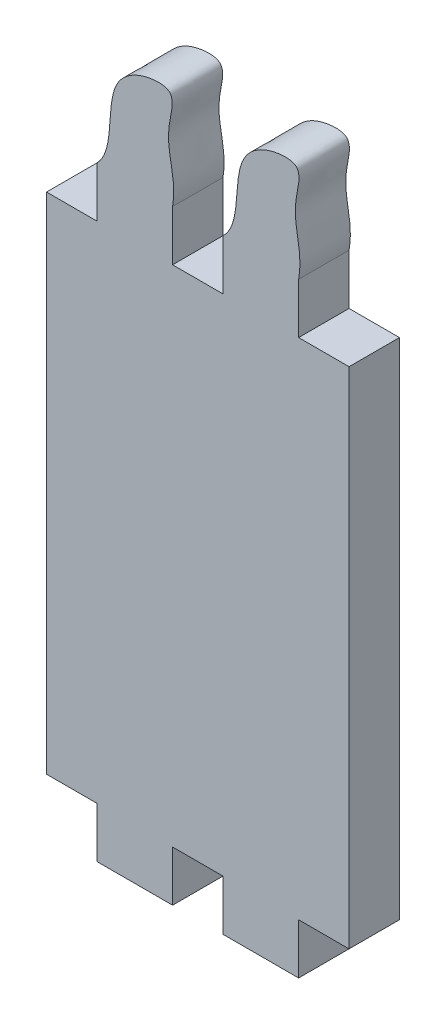
ISO-10303-21;
HEADER;
FILE_DESCRIPTION(('STEP AP214'),'2;1');
FILE_NAME('part.step','',(''),(''),'','','');
FILE_SCHEMA(('AUTOMOTIVE_DESIGN { 1 0 10303 214 1 1 1 1 }'));
ENDSEC;
DATA;
#1=APPLICATION_CONTEXT('core data for automotive mechanical design processes');
#2=APPLICATION_PROTOCOL_DEFINITION('international standard','automotive_design',2000,#1);
#3=PRODUCT_CONTEXT('',#1,'mechanical');
#4=PRODUCT('Part','Part','',(#3));
#5=PRODUCT_RELATED_PRODUCT_CATEGORY('part','',(#4));
#6=PRODUCT_DEFINITION_FORMATION('','',#4);
#7=PRODUCT_DEFINITION_CONTEXT('part definition',#1,'design');
#8=PRODUCT_DEFINITION('design','',#6,#7);
#9=PRODUCT_DEFINITION_SHAPE('','',#8);
#10=(LENGTH_UNIT() NAMED_UNIT(*) SI_UNIT(.MILLI.,.METRE.));
#11=(NAMED_UNIT(*) PLANE_ANGLE_UNIT() SI_UNIT($,.RADIAN.));
#12=(NAMED_UNIT(*) SI_UNIT($,.STERADIAN.) SOLID_ANGLE_UNIT());
#13=UNCERTAINTY_MEASURE_WITH_UNIT(LENGTH_MEASURE(1.E-05),#10,'distance_accuracy_value','');
#14=(GEOMETRIC_REPRESENTATION_CONTEXT(3) GLOBAL_UNCERTAINTY_ASSIGNED_CONTEXT((#13)) GLOBAL_UNIT_ASSIGNED_CONTEXT((#10,
#11,#12)) REPRESENTATION_CONTEXT('',''));
#15=CARTESIAN_POINT('',(0.,0.,0.));
#16=DIRECTION('',(0.,0.,1.));
#17=DIRECTION('',(1.,0.,0.));
#18=AXIS2_PLACEMENT_3D('',#15,#16,#17);
#19=CARTESIAN_POINT('',(1.5875,19.05,3.175));
#20=CARTESIAN_POINT('',(2.87606069652057,20.2829772560216,3.175));
#21=CARTESIAN_POINT('',(1.75087616831117,23.7170103339782,3.175));
#22=CARTESIAN_POINT('',(4.48010535425709,25.3439433085735,3.175));
#23=CARTESIAN_POINT('',(6.71396979884259,25.323271855298,3.175));
#24=CARTESIAN_POINT('',(5.66462971551239,22.0755663258377,3.175));
#25=CARTESIAN_POINT('',(6.66156491028358,20.8587639296577,3.175));
#26=CARTESIAN_POINT('',(6.35,19.05,3.175));
#27=B_SPLINE_CURVE_WITH_KNOTS('',3,(#19,#20,#21,#22,#23,#24,#25,#26),.UNSPECIFIED.,.F.,.F.,(4,1,
1,1,1,4),(0.,0.347503901702422,0.512635707363676,0.589513020634841,0.71223246177755,1.),.UNSPECIFIED.);
#28=DIRECTION('',(0.,0.,-1.));
#29=VECTOR('',#28,1.);
#30=SURFACE_OF_LINEAR_EXTRUSION('',#27,#29);
#31=CARTESIAN_POINT('',(1.5875,19.05,0.));
#32=CARTESIAN_POINT('',(2.87606069652057,20.2829772560216,0.));
#33=CARTESIAN_POINT('',(1.75087616831117,23.7170103339782,0.));
#34=CARTESIAN_POINT('',(4.48010535425709,25.3439433085735,0.));
#35=CARTESIAN_POINT('',(6.71396979884259,25.323271855298,0.));
#36=CARTESIAN_POINT('',(5.66462971551239,22.0755663258377,0.));
#37=CARTESIAN_POINT('',(6.66156491028358,20.8587639296577,0.));
#38=CARTESIAN_POINT('',(6.35,19.05,0.));
#39=B_SPLINE_CURVE_WITH_KNOTS('',3,(#31,#32,#33,#34,#35,#36,#37,#38),.UNSPECIFIED.,.F.,.F.,(4,1,
1,1,1,4),(0.,0.347503901702422,0.512635707363676,0.589513020634841,0.71223246177755,1.),.UNSPECIFIED.);
#40=CARTESIAN_POINT('',(1.5875,19.05,0.));
#41=VERTEX_POINT('',#40);
#42=CARTESIAN_POINT('',(6.35,19.05,0.));
#43=VERTEX_POINT('',#42);
#44=EDGE_CURVE('E336',#41,#43,#39,.T.);
#45=ORIENTED_EDGE('',*,*,#44,.F.);
#46=DIRECTION('',(0.,0.,-1.));
#47=VECTOR('',#46,1.);
#48=CARTESIAN_POINT('',(1.5875,19.05,3.175));
#49=LINE('',#48,#47);
#50=CARTESIAN_POINT('',(1.5875,19.05,3.175));
#51=VERTEX_POINT('',#50);
#52=EDGE_CURVE('E12',#51,#41,#49,.T.);
#53=ORIENTED_EDGE('',*,*,#52,.F.);
#54=CARTESIAN_POINT('',(6.35,19.05,3.175));
#55=VERTEX_POINT('',#54);
#56=EDGE_CURVE('E344',#51,#55,#27,.T.);
#57=ORIENTED_EDGE('',*,*,#56,.T.);
#58=DIRECTION('',(0.,0.,-1.));
#59=VECTOR('',#58,1.);
#60=CARTESIAN_POINT('',(6.35,19.05,3.175));
#61=LINE('',#60,#59);
#62=EDGE_CURVE('E206',#55,#43,#61,.T.);
#63=ORIENTED_EDGE('',*,*,#62,.T.);
#64=EDGE_LOOP('',(#45,#53,#57,#63));
#65=FACE_BOUND('',#64,.T.);
#66=ADVANCED_FACE('F196',(#65),#30,.T.);
#67=CARTESIAN_POINT('',(0.,0.,3.175));
#68=DIRECTION('',(0.,0.,1.));
#69=DIRECTION('',(1.,0.,0.));
#70=AXIS2_PLACEMENT_3D('',#67,#68,#69);
#71=PLANE('',#70);
#72=DIRECTION('',(0.,1.,0.));
#73=VECTOR('',#72,1.);
#74=CARTESIAN_POINT('',(-9.525,16.8856371785858,3.175));
#75=LINE('',#74,#73);
#76=CARTESIAN_POINT('',(-9.525,-15.875,3.175));
#77=VERTEX_POINT('',#76);
#78=CARTESIAN_POINT('',(-9.525,15.875,3.175));
#79=VERTEX_POINT('',#78);
#80=EDGE_CURVE('E426',#77,#79,#75,.T.);
#81=ORIENTED_EDGE('',*,*,#80,.F.);
#82=DIRECTION('',(-1.,0.,0.));
#83=VECTOR('',#82,1.);
#84=CARTESIAN_POINT('',(0.,-15.875,3.175));
#85=LINE('',#84,#83);
#86=CARTESIAN_POINT('',(-6.34999999999999,-15.875,3.175));
#87=VERTEX_POINT('',#86);
#88=EDGE_CURVE('E362',#87,#77,#85,.T.);
#89=ORIENTED_EDGE('',*,*,#88,.F.);
#90=DIRECTION('',(0.,-1.,0.));
#91=VECTOR('',#90,1.);
#92=CARTESIAN_POINT('',(-6.35,0.,3.175));
#93=LINE('',#92,#91);
#94=CARTESIAN_POINT('',(-6.34999999999999,-19.05,3.175));
#95=VERTEX_POINT('',#94);
#96=EDGE_CURVE('E368',#87,#95,#93,.T.);
#97=ORIENTED_EDGE('',*,*,#96,.T.);
#98=DIRECTION('',(1.,0.,0.));
#99=VECTOR('',#98,1.);
#100=CARTESIAN_POINT('',(0.,-19.05,3.175));
#101=LINE('',#100,#99);
#102=CARTESIAN_POINT('',(-1.58749999999999,-19.05,3.175));
#103=VERTEX_POINT('',#102);
#104=EDGE_CURVE('E523',#95,#103,#101,.T.);
#105=ORIENTED_EDGE('',*,*,#104,.T.);
#106=DIRECTION('',(0.,-1.,0.));
#107=VECTOR('',#106,1.);
#108=CARTESIAN_POINT('',(-1.5875,0.,3.175));
#109=LINE('',#108,#107);
#110=CARTESIAN_POINT('',(-1.58749999999999,-15.875,3.175));
#111=VERTEX_POINT('',#110);
#112=EDGE_CURVE('E525',#111,#103,#109,.T.);
#113=ORIENTED_EDGE('',*,*,#112,.F.);
#114=CARTESIAN_POINT('',(1.58750000000001,-15.875,3.175));
#115=VERTEX_POINT('',#114);
#116=EDGE_CURVE('E369',#115,#111,#85,.T.);
#117=ORIENTED_EDGE('',*,*,#116,.F.);
#118=DIRECTION('',(0.,-1.,0.));
#119=VECTOR('',#118,1.);
#120=CARTESIAN_POINT('',(1.5875,0.,3.175));
#121=LINE('',#120,#119);
#122=CARTESIAN_POINT('',(1.58750000000001,-19.05,3.175));
#123=VERTEX_POINT('',#122);
#124=EDGE_CURVE('E530',#115,#123,#121,.T.);
#125=ORIENTED_EDGE('',*,*,#124,.T.);
#126=DIRECTION('',(1.,0.,0.));
#127=VECTOR('',#126,1.);
#128=CARTESIAN_POINT('',(0.,-19.05,3.175));
#129=LINE('',#128,#127);
#130=CARTESIAN_POINT('',(6.35000000000001,-19.05,3.175));
#131=VERTEX_POINT('',#130);
#132=EDGE_CURVE('E532',#123,#131,#129,.T.);
#133=ORIENTED_EDGE('',*,*,#132,.T.);
#134=DIRECTION('',(0.,-1.,0.));
#135=VECTOR('',#134,1.);
#136=CARTESIAN_POINT('',(6.35,0.,3.175));
#137=LINE('',#136,#135);
#138=CARTESIAN_POINT('',(6.35000000000001,-15.875,3.175));
#139=VERTEX_POINT('',#138);
#140=EDGE_CURVE('E534',#139,#131,#137,.T.);
#141=ORIENTED_EDGE('',*,*,#140,.F.);
#142=CARTESIAN_POINT('',(9.525,-15.875,3.175));
#143=VERTEX_POINT('',#142);
#144=EDGE_CURVE('E358',#143,#139,#85,.T.);
#145=ORIENTED_EDGE('',*,*,#144,.F.);
#146=DIRECTION('',(0.,1.,0.));
#147=VECTOR('',#146,1.);
#148=CARTESIAN_POINT('',(9.525,0.,3.175));
#149=LINE('',#148,#147);
#150=CARTESIAN_POINT('',(9.525,15.875,3.175));
#151=VERTEX_POINT('',#150);
#152=EDGE_CURVE('E353',#143,#151,#149,.T.);
#153=ORIENTED_EDGE('',*,*,#152,.T.);
#154=DIRECTION('',(-1.,0.,0.));
#155=VECTOR('',#154,1.);
#156=CARTESIAN_POINT('',(0.,15.875,3.175));
#157=LINE('',#156,#155);
#158=CARTESIAN_POINT('',(6.35,15.875,3.175));
#159=VERTEX_POINT('',#158);
#160=EDGE_CURVE('E352',#151,#159,#157,.T.);
#161=ORIENTED_EDGE('',*,*,#160,.T.);
#162=DIRECTION('',(0.,1.,0.));
#163=VECTOR('',#162,1.);
#164=CARTESIAN_POINT('',(6.35,15.875,3.175));
#165=LINE('',#164,#163);
#166=EDGE_CURVE('E346',#159,#55,#165,.T.);
#167=ORIENTED_EDGE('',*,*,#166,.T.);
#168=ORIENTED_EDGE('',*,*,#56,.F.);
#169=DIRECTION('',(0.,1.,0.));
#170=VECTOR('',#169,1.);
#171=CARTESIAN_POINT('',(1.5875,15.875,3.175));
#172=LINE('',#171,#170);
#173=CARTESIAN_POINT('',(1.5875,15.875,3.175));
#174=VERTEX_POINT('',#173);
#175=EDGE_CURVE('E330',#174,#51,#172,.T.);
#176=ORIENTED_EDGE('',*,*,#175,.F.);
#177=CARTESIAN_POINT('',(-1.5875,15.875,3.175));
#178=VERTEX_POINT('',#177);
#179=EDGE_CURVE('E341',#174,#178,#157,.T.);
#180=ORIENTED_EDGE('',*,*,#179,.T.);
#181=DIRECTION('',(0.,1.,0.));
#182=VECTOR('',#181,1.);
#183=CARTESIAN_POINT('',(-1.5875,0.,3.175));
#184=LINE('',#183,#182);
#185=CARTESIAN_POINT('',(-1.5875,19.05,3.175));
#186=VERTEX_POINT('',#185);
#187=EDGE_CURVE('E357',#178,#186,#184,.T.);
#188=ORIENTED_EDGE('',*,*,#187,.T.);
#189=CARTESIAN_POINT('',(-6.35,19.05,3.175));
#190=CARTESIAN_POINT('',(-5.10894803273728,20.3128381420379,3.175));
#191=CARTESIAN_POINT('',(-6.2487975668104,23.7826275370671,3.175));
#192=CARTESIAN_POINT('',(-3.50466824511369,25.4227491748254,3.175));
#193=CARTESIAN_POINT('',(-1.27059543399362,25.4018504855543,3.175));
#194=CARTESIAN_POINT('',(-2.33046195009797,22.1181936868102,3.175));
#195=CARTESIAN_POINT('',(-1.30296019047837,20.9022932957206,3.175));
#196=CARTESIAN_POINT('',(-1.5875,19.05,3.175));
#197=B_SPLINE_CURVE_WITH_KNOTS('',3,(#189,#190,#191,#192,#193,#194,#195,#196),.UNSPECIFIED.,.F.,
.F.,(4,1,1,1,1,4),(0.,0.348300856335532,0.511853830627675,0.58799611703179,0.709542233008579,
1.),.UNSPECIFIED.);
#198=CARTESIAN_POINT('',(-6.35,19.05,3.175));
#199=VERTEX_POINT('',#198);
#200=EDGE_CURVE('E462',#199,#186,#197,.T.);
#201=ORIENTED_EDGE('',*,*,#200,.F.);
#202=DIRECTION('',(0.,1.,0.));
#203=VECTOR('',#202,1.);
#204=CARTESIAN_POINT('',(-6.35,0.,3.175));
#205=LINE('',#204,#203);
#206=CARTESIAN_POINT('',(-6.35,15.875,3.175));
#207=VERTEX_POINT('',#206);
#208=EDGE_CURVE('E386',#207,#199,#205,.T.);
#209=ORIENTED_EDGE('',*,*,#208,.F.);
#210=EDGE_CURVE('E355',#207,#79,#157,.T.);
#211=ORIENTED_EDGE('',*,*,#210,.T.);
#212=EDGE_LOOP('',(#81,#89,#97,#105,#113,#117,#125,#133,#141,#145,#153,#161,#167,#168,#176,#180,
#188,#201,#209,#211));
#213=FACE_BOUND('',#212,.T.);
#214=ADVANCED_FACE('F340',(#213),#71,.T.);
#215=CARTESIAN_POINT('',(0.,0.,0.));
#216=DIRECTION('',(0.,0.,1.));
#217=DIRECTION('',(1.,0.,0.));
#218=AXIS2_PLACEMENT_3D('',#215,#216,#217);
#219=PLANE('',#218);
#220=DIRECTION('',(-1.,0.,0.));
#221=VECTOR('',#220,1.);
#222=CARTESIAN_POINT('',(0.,-15.875,0.));
#223=LINE('',#222,#221);
#224=CARTESIAN_POINT('',(-6.34999999999999,-15.875,0.));
#225=VERTEX_POINT('',#224);
#226=CARTESIAN_POINT('',(-9.525,-15.875,0.));
#227=VERTEX_POINT('',#226);
#228=EDGE_CURVE('E475',#225,#227,#223,.T.);
#229=ORIENTED_EDGE('',*,*,#228,.T.);
#230=DIRECTION('',(0.,1.,0.));
#231=VECTOR('',#230,1.);
#232=CARTESIAN_POINT('',(-9.525,16.8856371785858,0.));
#233=LINE('',#232,#231);
#234=CARTESIAN_POINT('',(-9.525,15.875,0.));
#235=VERTEX_POINT('',#234);
#236=EDGE_CURVE('E422',#227,#235,#233,.T.);
#237=ORIENTED_EDGE('',*,*,#236,.T.);
#238=DIRECTION('',(-1.,0.,0.));
#239=VECTOR('',#238,1.);
#240=CARTESIAN_POINT('',(0.,15.875,0.));
#241=LINE('',#240,#239);
#242=CARTESIAN_POINT('',(-6.35,15.875,0.));
#243=VERTEX_POINT('',#242);
#244=EDGE_CURVE('E345',#243,#235,#241,.T.);
#245=ORIENTED_EDGE('',*,*,#244,.F.);
#246=DIRECTION('',(0.,1.,0.));
#247=VECTOR('',#246,1.);
#248=CARTESIAN_POINT('',(-6.35,0.,0.));
#249=LINE('',#248,#247);
#250=CARTESIAN_POINT('',(-6.35,19.05,0.));
#251=VERTEX_POINT('',#250);
#252=EDGE_CURVE('E363',#243,#251,#249,.T.);
#253=ORIENTED_EDGE('',*,*,#252,.T.);
#254=CARTESIAN_POINT('',(-6.35,19.05,0.));
#255=CARTESIAN_POINT('',(-5.10894803273728,20.3128381420379,0.));
#256=CARTESIAN_POINT('',(-6.2487975668104,23.7826275370671,0.));
#257=CARTESIAN_POINT('',(-3.50466824511369,25.4227491748254,0.));
#258=CARTESIAN_POINT('',(-1.27059543399362,25.4018504855543,0.));
#259=CARTESIAN_POINT('',(-2.33046195009797,22.1181936868102,0.));
#260=CARTESIAN_POINT('',(-1.30296019047837,20.9022932957206,0.));
#261=CARTESIAN_POINT('',(-1.5875,19.05,0.));
#262=B_SPLINE_CURVE_WITH_KNOTS('',3,(#254,#255,#256,#257,#258,#259,#260,#261),.UNSPECIFIED.,.F.,
.F.,(4,1,1,1,1,4),(0.,0.348300856335532,0.511853830627675,0.58799611703179,0.709542233008579,
1.),.UNSPECIFIED.);
#263=CARTESIAN_POINT('',(-1.5875,19.05,0.));
#264=VERTEX_POINT('',#263);
#265=EDGE_CURVE('E371',#251,#264,#262,.T.);
#266=ORIENTED_EDGE('',*,*,#265,.T.);
#267=DIRECTION('',(0.,1.,0.));
#268=VECTOR('',#267,1.);
#269=CARTESIAN_POINT('',(-1.5875,0.,0.));
#270=LINE('',#269,#268);
#271=CARTESIAN_POINT('',(-1.5875,15.875,0.));
#272=VERTEX_POINT('',#271);
#273=EDGE_CURVE('E377',#272,#264,#270,.T.);
#274=ORIENTED_EDGE('',*,*,#273,.F.);
#275=CARTESIAN_POINT('',(1.5875,15.875,0.));
#276=VERTEX_POINT('',#275);
#277=EDGE_CURVE('E476',#276,#272,#241,.T.);
#278=ORIENTED_EDGE('',*,*,#277,.F.);
#279=DIRECTION('',(0.,1.,0.));
#280=VECTOR('',#279,1.);
#281=CARTESIAN_POINT('',(1.5875,15.875,0.));
#282=LINE('',#281,#280);
#283=EDGE_CURVE('E200',#276,#41,#282,.T.);
#284=ORIENTED_EDGE('',*,*,#283,.T.);
#285=ORIENTED_EDGE('',*,*,#44,.T.);
#286=DIRECTION('',(0.,1.,0.));
#287=VECTOR('',#286,1.);
#288=CARTESIAN_POINT('',(6.35,15.875,0.));
#289=LINE('',#288,#287);
#290=CARTESIAN_POINT('',(6.35,15.875,0.));
#291=VERTEX_POINT('',#290);
#292=EDGE_CURVE('E421',#291,#43,#289,.T.);
#293=ORIENTED_EDGE('',*,*,#292,.F.);
#294=CARTESIAN_POINT('',(9.525,15.875,0.));
#295=VERTEX_POINT('',#294);
#296=EDGE_CURVE('E477',#295,#291,#241,.T.);
#297=ORIENTED_EDGE('',*,*,#296,.F.);
#298=DIRECTION('',(0.,1.,0.));
#299=VECTOR('',#298,1.);
#300=CARTESIAN_POINT('',(9.525,0.,0.));
#301=LINE('',#300,#299);
#302=CARTESIAN_POINT('',(9.525,-15.875,0.));
#303=VERTEX_POINT('',#302);
#304=EDGE_CURVE('E497',#303,#295,#301,.T.);
#305=ORIENTED_EDGE('',*,*,#304,.F.);
#306=CARTESIAN_POINT('',(6.35000000000001,-15.875,0.));
#307=VERTEX_POINT('',#306);
#308=EDGE_CURVE('E480',#303,#307,#223,.T.);
#309=ORIENTED_EDGE('',*,*,#308,.T.);
#310=DIRECTION('',(0.,-1.,0.));
#311=VECTOR('',#310,1.);
#312=CARTESIAN_POINT('',(6.35,0.,0.));
#313=LINE('',#312,#311);
#314=CARTESIAN_POINT('',(6.35000000000001,-19.05,0.));
#315=VERTEX_POINT('',#314);
#316=EDGE_CURVE('E494',#307,#315,#313,.T.);
#317=ORIENTED_EDGE('',*,*,#316,.T.);
#318=DIRECTION('',(1.,0.,0.));
#319=VECTOR('',#318,1.);
#320=CARTESIAN_POINT('',(0.,-19.05,0.));
#321=LINE('',#320,#319);
#322=CARTESIAN_POINT('',(1.58750000000001,-19.05,0.));
#323=VERTEX_POINT('',#322);
#324=EDGE_CURVE('E491',#323,#315,#321,.T.);
#325=ORIENTED_EDGE('',*,*,#324,.F.);
#326=DIRECTION('',(0.,-1.,0.));
#327=VECTOR('',#326,1.);
#328=CARTESIAN_POINT('',(1.5875,0.,0.));
#329=LINE('',#328,#327);
#330=CARTESIAN_POINT('',(1.58750000000001,-15.875,0.));
#331=VERTEX_POINT('',#330);
#332=EDGE_CURVE('E489',#331,#323,#329,.T.);
#333=ORIENTED_EDGE('',*,*,#332,.F.);
#334=CARTESIAN_POINT('',(-1.58749999999999,-15.875,0.));
#335=VERTEX_POINT('',#334);
#336=EDGE_CURVE('E481',#331,#335,#223,.T.);
#337=ORIENTED_EDGE('',*,*,#336,.T.);
#338=DIRECTION('',(0.,-1.,0.));
#339=VECTOR('',#338,1.);
#340=CARTESIAN_POINT('',(-1.5875,0.,0.));
#341=LINE('',#340,#339);
#342=CARTESIAN_POINT('',(-1.58749999999999,-19.05,0.));
#343=VERTEX_POINT('',#342);
#344=EDGE_CURVE('E486',#335,#343,#341,.T.);
#345=ORIENTED_EDGE('',*,*,#344,.T.);
#346=DIRECTION('',(1.,0.,0.));
#347=VECTOR('',#346,1.);
#348=CARTESIAN_POINT('',(0.,-19.05,0.));
#349=LINE('',#348,#347);
#350=CARTESIAN_POINT('',(-6.34999999999999,-19.05,0.));
#351=VERTEX_POINT('',#350);
#352=EDGE_CURVE('E483',#351,#343,#349,.T.);
#353=ORIENTED_EDGE('',*,*,#352,.F.);
#354=DIRECTION('',(0.,-1.,0.));
#355=VECTOR('',#354,1.);
#356=CARTESIAN_POINT('',(-6.35,0.,0.));
#357=LINE('',#356,#355);
#358=EDGE_CURVE('E479',#225,#351,#357,.T.);
#359=ORIENTED_EDGE('',*,*,#358,.F.);
#360=EDGE_LOOP('',(#229,#237,#245,#253,#266,#274,#278,#284,#285,#293,#297,#305,#309,#317,#325,
#333,#337,#345,#353,#359));
#361=FACE_BOUND('',#360,.T.);
#362=ADVANCED_FACE('F449',(#361),#219,.F.);
#363=CARTESIAN_POINT('',(0.,-15.875,3.175));
#364=DIRECTION('',(0.,-1.,0.));
#365=DIRECTION('',(0.,0.,-1.));
#366=AXIS2_PLACEMENT_3D('',#363,#364,#365);
#367=PLANE('',#366);
#368=ORIENTED_EDGE('',*,*,#228,.F.);
#369=DIRECTION('',(0.,0.,-1.));
#370=VECTOR('',#369,1.);
#371=CARTESIAN_POINT('',(-6.34999999999999,-15.875,3.175));
#372=LINE('',#371,#370);
#373=EDGE_CURVE('E412',#87,#225,#372,.T.);
#374=ORIENTED_EDGE('',*,*,#373,.F.);
#375=ORIENTED_EDGE('',*,*,#88,.T.);
#376=DIRECTION('',(0.,0.,-1.));
#377=VECTOR('',#376,1.);
#378=CARTESIAN_POINT('',(-9.525,-15.875,3.175));
#379=LINE('',#378,#377);
#380=EDGE_CURVE('E414',#77,#227,#379,.T.);
#381=ORIENTED_EDGE('',*,*,#380,.T.);
#382=EDGE_LOOP('',(#368,#374,#375,#381));
#383=FACE_BOUND('',#382,.T.);
#384=ADVANCED_FACE('F516',(#383),#367,.T.);
#385=CARTESIAN_POINT('',(-6.35,0.,3.175));
#386=DIRECTION('',(1.,0.,0.));
#387=DIRECTION('',(0.,1.,0.));
#388=AXIS2_PLACEMENT_3D('',#385,#386,#387);
#389=PLANE('',#388);
#390=ORIENTED_EDGE('',*,*,#358,.T.);
#391=DIRECTION('',(0.,0.,-1.));
#392=VECTOR('',#391,1.);
#393=CARTESIAN_POINT('',(-6.34999999999999,-19.05,3.175));
#394=LINE('',#393,#392);
#395=EDGE_CURVE('E409',#95,#351,#394,.T.);
#396=ORIENTED_EDGE('',*,*,#395,.F.);
#397=ORIENTED_EDGE('',*,*,#96,.F.);
#398=ORIENTED_EDGE('',*,*,#373,.T.);
#399=EDGE_LOOP('',(#390,#396,#397,#398));
#400=FACE_BOUND('',#399,.T.);
#401=ADVANCED_FACE('F521',(#400),#389,.F.);
#402=CARTESIAN_POINT('',(0.,-19.05,3.175));
#403=DIRECTION('',(0.,1.,0.));
#404=DIRECTION('',(0.,0.,1.));
#405=AXIS2_PLACEMENT_3D('',#402,#403,#404);
#406=PLANE('',#405);
#407=ORIENTED_EDGE('',*,*,#352,.T.);
#408=DIRECTION('',(0.,0.,-1.));
#409=VECTOR('',#408,1.);
#410=CARTESIAN_POINT('',(-1.58749999999999,-19.05,3.175));
#411=LINE('',#410,#409);
#412=EDGE_CURVE('E407',#103,#343,#411,.T.);
#413=ORIENTED_EDGE('',*,*,#412,.F.);
#414=ORIENTED_EDGE('',*,*,#104,.F.);
#415=ORIENTED_EDGE('',*,*,#395,.T.);
#416=EDGE_LOOP('',(#407,#413,#414,#415));
#417=FACE_BOUND('',#416,.T.);
#418=ADVANCED_FACE('F588',(#417),#406,.F.);
#419=CARTESIAN_POINT('',(-1.5875,0.,3.175));
#420=DIRECTION('',(1.,0.,0.));
#421=DIRECTION('',(0.,1.,0.));
#422=AXIS2_PLACEMENT_3D('',#419,#420,#421);
#423=PLANE('',#422);
#424=ORIENTED_EDGE('',*,*,#344,.F.);
#425=DIRECTION('',(0.,0.,-1.));
#426=VECTOR('',#425,1.);
#427=CARTESIAN_POINT('',(-1.58749999999999,-15.875,3.175));
#428=LINE('',#427,#426);
#429=EDGE_CURVE('E405',#111,#335,#428,.T.);
#430=ORIENTED_EDGE('',*,*,#429,.F.);
#431=ORIENTED_EDGE('',*,*,#112,.T.);
#432=ORIENTED_EDGE('',*,*,#412,.T.);
#433=EDGE_LOOP('',(#424,#430,#431,#432));
#434=FACE_BOUND('',#433,.T.);
#435=ADVANCED_FACE('F552',(#434),#423,.T.);
#436=ORIENTED_EDGE('',*,*,#336,.F.);
#437=DIRECTION('',(0.,0.,-1.));
#438=VECTOR('',#437,1.);
#439=CARTESIAN_POINT('',(1.58750000000001,-15.875,3.175));
#440=LINE('',#439,#438);
#441=EDGE_CURVE('E403',#115,#331,#440,.T.);
#442=ORIENTED_EDGE('',*,*,#441,.F.);
#443=ORIENTED_EDGE('',*,*,#116,.T.);
#444=ORIENTED_EDGE('',*,*,#429,.T.);
#445=EDGE_LOOP('',(#436,#442,#443,#444));
#446=FACE_BOUND('',#445,.T.);
#447=ADVANCED_FACE('F545',(#446),#367,.T.);
#448=CARTESIAN_POINT('',(1.5875,0.,3.175));
#449=DIRECTION('',(1.,0.,0.));
#450=DIRECTION('',(0.,1.,0.));
#451=AXIS2_PLACEMENT_3D('',#448,#449,#450);
#452=PLANE('',#451);
#453=ORIENTED_EDGE('',*,*,#332,.T.);
#454=DIRECTION('',(0.,0.,-1.));
#455=VECTOR('',#454,1.);
#456=CARTESIAN_POINT('',(1.58750000000001,-19.05,3.175));
#457=LINE('',#456,#455);
#458=EDGE_CURVE('E400',#123,#323,#457,.T.);
#459=ORIENTED_EDGE('',*,*,#458,.F.);
#460=ORIENTED_EDGE('',*,*,#124,.F.);
#461=ORIENTED_EDGE('',*,*,#441,.T.);
#462=EDGE_LOOP('',(#453,#459,#460,#461));
#463=FACE_BOUND('',#462,.T.);
#464=ADVANCED_FACE('F569',(#463),#452,.F.);
#465=CARTESIAN_POINT('',(0.,-19.05,3.175));
#466=DIRECTION('',(0.,1.,0.));
#467=DIRECTION('',(0.,0.,1.));
#468=AXIS2_PLACEMENT_3D('',#465,#466,#467);
#469=PLANE('',#468);
#470=ORIENTED_EDGE('',*,*,#324,.T.);
#471=DIRECTION('',(0.,0.,-1.));
#472=VECTOR('',#471,1.);
#473=CARTESIAN_POINT('',(6.35000000000001,-19.05,3.175));
#474=LINE('',#473,#472);
#475=EDGE_CURVE('E398',#131,#315,#474,.T.);
#476=ORIENTED_EDGE('',*,*,#475,.F.);
#477=ORIENTED_EDGE('',*,*,#132,.F.);
#478=ORIENTED_EDGE('',*,*,#458,.T.);
#479=EDGE_LOOP('',(#470,#476,#477,#478));
#480=FACE_BOUND('',#479,.T.);
#481=ADVANCED_FACE('F567',(#480),#469,.F.);
#482=CARTESIAN_POINT('',(6.35,0.,3.175));
#483=DIRECTION('',(1.,0.,0.));
#484=DIRECTION('',(0.,1.,0.));
#485=AXIS2_PLACEMENT_3D('',#482,#483,#484);
#486=PLANE('',#485);
#487=ORIENTED_EDGE('',*,*,#316,.F.);
#488=DIRECTION('',(0.,0.,-1.));
#489=VECTOR('',#488,1.);
#490=CARTESIAN_POINT('',(6.35000000000001,-15.875,3.175));
#491=LINE('',#490,#489);
#492=EDGE_CURVE('E396',#139,#307,#491,.T.);
#493=ORIENTED_EDGE('',*,*,#492,.F.);
#494=ORIENTED_EDGE('',*,*,#140,.T.);
#495=ORIENTED_EDGE('',*,*,#475,.T.);
#496=EDGE_LOOP('',(#487,#493,#494,#495));
#497=FACE_BOUND('',#496,.T.);
#498=ADVANCED_FACE('F563',(#497),#486,.T.);
#499=ORIENTED_EDGE('',*,*,#308,.F.);
#500=DIRECTION('',(0.,0.,-1.));
#501=VECTOR('',#500,1.);
#502=CARTESIAN_POINT('',(9.525,-15.875,3.175));
#503=LINE('',#502,#501);
#504=EDGE_CURVE('E394',#143,#303,#503,.T.);
#505=ORIENTED_EDGE('',*,*,#504,.F.);
#506=ORIENTED_EDGE('',*,*,#144,.T.);
#507=ORIENTED_EDGE('',*,*,#492,.T.);
#508=EDGE_LOOP('',(#499,#505,#506,#507));
#509=FACE_BOUND('',#508,.T.);
#510=ADVANCED_FACE('F561',(#509),#367,.T.);
#511=CARTESIAN_POINT('',(9.525,0.,3.175));
#512=DIRECTION('',(-1.,0.,0.));
#513=DIRECTION('',(0.,-1.,0.));
#514=AXIS2_PLACEMENT_3D('',#511,#512,#513);
#515=PLANE('',#514);
#516=ORIENTED_EDGE('',*,*,#304,.T.);
#517=DIRECTION('',(0.,0.,-1.));
#518=VECTOR('',#517,1.);
#519=CARTESIAN_POINT('',(9.525,15.875,3.175));
#520=LINE('',#519,#518);
#521=EDGE_CURVE('E391',#151,#295,#520,.T.);
#522=ORIENTED_EDGE('',*,*,#521,.F.);
#523=ORIENTED_EDGE('',*,*,#152,.F.);
#524=ORIENTED_EDGE('',*,*,#504,.T.);
#525=EDGE_LOOP('',(#516,#522,#523,#524));
#526=FACE_BOUND('',#525,.T.);
#527=ADVANCED_FACE('F627',(#526),#515,.F.);
#528=CARTESIAN_POINT('',(-1.5875,0.,3.175));
#529=DIRECTION('',(-1.,0.,0.));
#530=DIRECTION('',(0.,0.,1.));
#531=AXIS2_PLACEMENT_3D('',#528,#529,#530);
#532=PLANE('',#531);
#533=ORIENTED_EDGE('',*,*,#273,.T.);
#534=DIRECTION('',(0.,0.,-1.));
#535=VECTOR('',#534,1.);
#536=CARTESIAN_POINT('',(-1.5875,19.05,3.175));
#537=LINE('',#536,#535);
#538=EDGE_CURVE('E388',#186,#264,#537,.T.);
#539=ORIENTED_EDGE('',*,*,#538,.F.);
#540=ORIENTED_EDGE('',*,*,#187,.F.);
#541=DIRECTION('',(0.,0.,-1.));
#542=VECTOR('',#541,1.);
#543=CARTESIAN_POINT('',(-1.5875,15.875,3.175));
#544=LINE('',#543,#542);
#545=EDGE_CURVE('E350',#178,#272,#544,.T.);
#546=ORIENTED_EDGE('',*,*,#545,.T.);
#547=EDGE_LOOP('',(#533,#539,#540,#546));
#548=FACE_BOUND('',#547,.T.);
#549=ADVANCED_FACE('F459',(#548),#532,.F.);
#550=DIRECTION('',(0.,0.,-1.));
#551=VECTOR('',#550,1.);
#552=SURFACE_OF_LINEAR_EXTRUSION('',#197,#551);
#553=ORIENTED_EDGE('',*,*,#265,.F.);
#554=DIRECTION('',(0.,0.,-1.));
#555=VECTOR('',#554,1.);
#556=CARTESIAN_POINT('',(-6.35,19.05,3.175));
#557=LINE('',#556,#555);
#558=EDGE_CURVE('E385',#199,#251,#557,.T.);
#559=ORIENTED_EDGE('',*,*,#558,.F.);
#560=ORIENTED_EDGE('',*,*,#200,.T.);
#561=ORIENTED_EDGE('',*,*,#538,.T.);
#562=EDGE_LOOP('',(#553,#559,#560,#561));
#563=FACE_BOUND('',#562,.T.);
#564=ADVANCED_FACE('F454',(#563),#552,.T.);
#565=CARTESIAN_POINT('',(-6.35,0.,3.175));
#566=DIRECTION('',(-1.,0.,0.));
#567=DIRECTION('',(0.,0.,1.));
#568=AXIS2_PLACEMENT_3D('',#565,#566,#567);
#569=PLANE('',#568);
#570=ORIENTED_EDGE('',*,*,#252,.F.);
#571=DIRECTION('',(0.,0.,-1.));
#572=VECTOR('',#571,1.);
#573=CARTESIAN_POINT('',(-6.35,15.875,3.175));
#574=LINE('',#573,#572);
#575=EDGE_CURVE('E383',#207,#243,#574,.T.);
#576=ORIENTED_EDGE('',*,*,#575,.F.);
#577=ORIENTED_EDGE('',*,*,#208,.T.);
#578=ORIENTED_EDGE('',*,*,#558,.T.);
#579=EDGE_LOOP('',(#570,#576,#577,#578));
#580=FACE_BOUND('',#579,.T.);
#581=ADVANCED_FACE('F448',(#580),#569,.T.);
#582=CARTESIAN_POINT('',(0.,15.875,3.175));
#583=DIRECTION('',(0.,-1.,0.));
#584=DIRECTION('',(0.,0.,-1.));
#585=AXIS2_PLACEMENT_3D('',#582,#583,#584);
#586=PLANE('',#585);
#587=ORIENTED_EDGE('',*,*,#244,.T.);
#588=DIRECTION('',(0.,0.,-1.));
#589=VECTOR('',#588,1.);
#590=CARTESIAN_POINT('',(-9.525,15.875,3.175));
#591=LINE('',#590,#589);
#592=EDGE_CURVE('E417',#79,#235,#591,.T.);
#593=ORIENTED_EDGE('',*,*,#592,.F.);
#594=ORIENTED_EDGE('',*,*,#210,.F.);
#595=ORIENTED_EDGE('',*,*,#575,.T.);
#596=EDGE_LOOP('',(#587,#593,#594,#595));
#597=FACE_BOUND('',#596,.T.);
#598=ADVANCED_FACE('F453',(#597),#586,.F.);
#599=ORIENTED_EDGE('',*,*,#179,.F.);
#600=DIRECTION('',(0.,0.,-1.));
#601=VECTOR('',#600,1.);
#602=CARTESIAN_POINT('',(1.5875,15.875,3.175));
#603=LINE('',#602,#601);
#604=EDGE_CURVE('E327',#174,#276,#603,.T.);
#605=ORIENTED_EDGE('',*,*,#604,.T.);
#606=ORIENTED_EDGE('',*,*,#277,.T.);
#607=ORIENTED_EDGE('',*,*,#545,.F.);
#608=EDGE_LOOP('',(#599,#605,#606,#607));
#609=FACE_BOUND('',#608,.T.);
#610=ADVANCED_FACE('F348',(#609),#586,.F.);
#611=DIRECTION('',(0.,0.,-1.));
#612=VECTOR('',#611,1.);
#613=CARTESIAN_POINT('',(6.35,15.875,3.175));
#614=LINE('',#613,#612);
#615=EDGE_CURVE('E322',#159,#291,#614,.T.);
#616=ORIENTED_EDGE('',*,*,#615,.F.);
#617=ORIENTED_EDGE('',*,*,#160,.F.);
#618=ORIENTED_EDGE('',*,*,#521,.T.);
#619=ORIENTED_EDGE('',*,*,#296,.T.);
#620=EDGE_LOOP('',(#616,#617,#618,#619));
#621=FACE_BOUND('',#620,.T.);
#622=ADVANCED_FACE('F580',(#621),#586,.F.);
#623=CARTESIAN_POINT('',(1.5875,15.875,3.175));
#624=DIRECTION('',(-1.,0.,0.));
#625=DIRECTION('',(0.,-1.,0.));
#626=AXIS2_PLACEMENT_3D('',#623,#624,#625);
#627=PLANE('',#626);
#628=ORIENTED_EDGE('',*,*,#283,.F.);
#629=ORIENTED_EDGE('',*,*,#604,.F.);
#630=ORIENTED_EDGE('',*,*,#175,.T.);
#631=ORIENTED_EDGE('',*,*,#52,.T.);
#632=EDGE_LOOP('',(#628,#629,#630,#631));
#633=FACE_BOUND('',#632,.T.);
#634=ADVANCED_FACE('F329',(#633),#627,.T.);
#635=CARTESIAN_POINT('',(6.35,15.875,3.175));
#636=DIRECTION('',(-1.,0.,0.));
#637=DIRECTION('',(0.,0.,1.));
#638=AXIS2_PLACEMENT_3D('',#635,#636,#637);
#639=PLANE('',#638);
#640=ORIENTED_EDGE('',*,*,#292,.T.);
#641=ORIENTED_EDGE('',*,*,#62,.F.);
#642=ORIENTED_EDGE('',*,*,#166,.F.);
#643=ORIENTED_EDGE('',*,*,#615,.T.);
#644=EDGE_LOOP('',(#640,#641,#642,#643));
#645=FACE_BOUND('',#644,.T.);
#646=ADVANCED_FACE('F198',(#645),#639,.F.);
#647=CARTESIAN_POINT('',(-9.525,16.8856371785858,0.));
#648=DIRECTION('',(1.,0.,0.));
#649=DIRECTION('',(0.,1.,0.));
#650=AXIS2_PLACEMENT_3D('',#647,#648,#649);
#651=PLANE('',#650);
#652=ORIENTED_EDGE('',*,*,#380,.F.);
#653=ORIENTED_EDGE('',*,*,#80,.T.);
#654=ORIENTED_EDGE('',*,*,#592,.T.);
#655=ORIENTED_EDGE('',*,*,#236,.F.);
#656=EDGE_LOOP('',(#652,#653,#654,#655));
#657=FACE_BOUND('',#656,.T.);
#658=ADVANCED_FACE('F508',(#657),#651,.F.);
#659=CLOSED_SHELL('',(#66,#214,#362,#384,#401,#418,#435,#447,#464,#481,#498,#510,#527,#549,#564,
#581,#598,#610,#622,#634,#646,#658));
#660=MANIFOLD_SOLID_BREP('B2',#659);
#661=ADVANCED_BREP_SHAPE_REPRESENTATION('',(#18,#660),#14);
#662=SHAPE_DEFINITION_REPRESENTATION(#9,#661);
ENDSEC;
END-ISO-10303-21;
